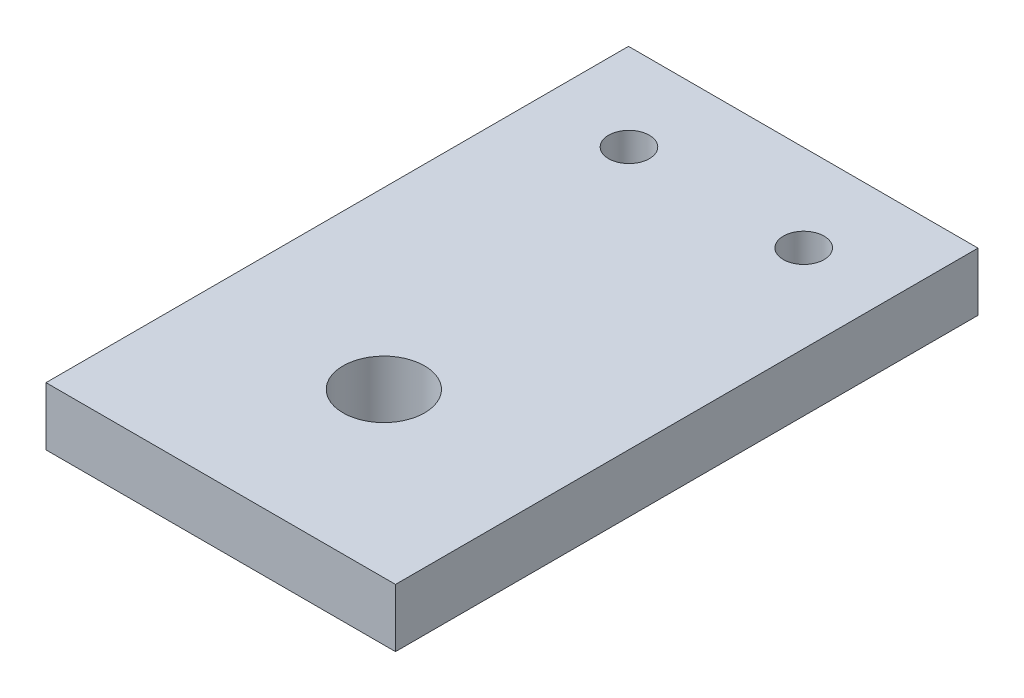
ISO-10303-21;
HEADER;
FILE_DESCRIPTION(('STEP AP214'),'2;1');
FILE_NAME('part.step','',(''),(''),'','','');
FILE_SCHEMA(('AUTOMOTIVE_DESIGN { 1 0 10303 214 1 1 1 1 }'));
ENDSEC;
DATA;
#1=APPLICATION_CONTEXT('core data for automotive mechanical design processes');
#2=APPLICATION_PROTOCOL_DEFINITION('international standard','automotive_design',2000,#1);
#3=PRODUCT_CONTEXT('',#1,'mechanical');
#4=PRODUCT('Part','Part','',(#3));
#5=PRODUCT_RELATED_PRODUCT_CATEGORY('part','',(#4));
#6=PRODUCT_DEFINITION_FORMATION('','',#4);
#7=PRODUCT_DEFINITION_CONTEXT('part definition',#1,'design');
#8=PRODUCT_DEFINITION('design','',#6,#7);
#9=PRODUCT_DEFINITION_SHAPE('','',#8);
#10=(LENGTH_UNIT() NAMED_UNIT(*) SI_UNIT(.MILLI.,.METRE.));
#11=(NAMED_UNIT(*) PLANE_ANGLE_UNIT() SI_UNIT($,.RADIAN.));
#12=(NAMED_UNIT(*) SI_UNIT($,.STERADIAN.) SOLID_ANGLE_UNIT());
#13=UNCERTAINTY_MEASURE_WITH_UNIT(LENGTH_MEASURE(1.E-05),#10,'distance_accuracy_value','');
#14=(GEOMETRIC_REPRESENTATION_CONTEXT(3) GLOBAL_UNCERTAINTY_ASSIGNED_CONTEXT((#13)) GLOBAL_UNIT_ASSIGNED_CONTEXT((#10,
#11,#12)) REPRESENTATION_CONTEXT('',''));
#15=CARTESIAN_POINT('',(0.,0.,0.));
#16=DIRECTION('',(0.,0.,1.));
#17=DIRECTION('',(1.,0.,0.));
#18=AXIS2_PLACEMENT_3D('',#15,#16,#17);
#19=CARTESIAN_POINT('',(0.,5.,0.));
#20=DIRECTION('',(0.,-1.,0.));
#21=DIRECTION('',(0.,0.,-1.));
#22=AXIS2_PLACEMENT_3D('',#19,#20,#21);
#23=PLANE('',#22);
#24=CARTESIAN_POINT('',(-7.50000000000001,5.,-28.5391035930864));
#25=DIRECTION('',(0.,-1.,0.));
#26=DIRECTION('',(0.,0.,-1.));
#27=AXIS2_PLACEMENT_3D('',#24,#25,#26);
#28=CIRCLE('',#27,1.75);
#29=CARTESIAN_POINT('',(-7.50000000000001,5.,-30.2891035930864));
#30=VERTEX_POINT('',#29);
#31=EDGE_CURVE('E126',#30,#30,#28,.T.);
#32=ORIENTED_EDGE('',*,*,#31,.T.);
#33=EDGE_LOOP('',(#32));
#34=FACE_BOUND('',#33,.T.);
#35=CARTESIAN_POINT('',(7.49999999999999,5.,-28.5391035930864));
#36=DIRECTION('',(0.,-1.,0.));
#37=DIRECTION('',(0.,0.,-1.));
#38=AXIS2_PLACEMENT_3D('',#35,#36,#37);
#39=CIRCLE('',#38,1.75);
#40=CARTESIAN_POINT('',(7.49999999999999,5.,-30.2891035930864));
#41=VERTEX_POINT('',#40);
#42=EDGE_CURVE('E118',#41,#41,#39,.T.);
#43=ORIENTED_EDGE('',*,*,#42,.T.);
#44=EDGE_LOOP('',(#43));
#45=FACE_BOUND('',#44,.T.);
#46=DIRECTION('',(0.,0.,-1.));
#47=VECTOR('',#46,1.);
#48=CARTESIAN_POINT('',(15.,5.,-36.));
#49=LINE('',#48,#47);
#50=CARTESIAN_POINT('',(15.,5.,14.));
#51=VERTEX_POINT('',#50);
#52=CARTESIAN_POINT('',(15.,5.,-36.));
#53=VERTEX_POINT('',#52);
#54=EDGE_CURVE('E88',#51,#53,#49,.T.);
#55=ORIENTED_EDGE('',*,*,#54,.T.);
#56=DIRECTION('',(-1.,0.,0.));
#57=VECTOR('',#56,1.);
#58=CARTESIAN_POINT('',(15.,5.,-36.));
#59=LINE('',#58,#57);
#60=CARTESIAN_POINT('',(-15.,5.,-36.));
#61=VERTEX_POINT('',#60);
#62=EDGE_CURVE('E83',#53,#61,#59,.T.);
#63=ORIENTED_EDGE('',*,*,#62,.T.);
#64=DIRECTION('',(0.,0.,1.));
#65=VECTOR('',#64,1.);
#66=CARTESIAN_POINT('',(-15.,5.,-36.));
#67=LINE('',#66,#65);
#68=CARTESIAN_POINT('',(-15.,5.,14.));
#69=VERTEX_POINT('',#68);
#70=EDGE_CURVE('E86',#61,#69,#67,.T.);
#71=ORIENTED_EDGE('',*,*,#70,.T.);
#72=DIRECTION('',(1.,0.,0.));
#73=VECTOR('',#72,1.);
#74=CARTESIAN_POINT('',(15.,5.,14.));
#75=LINE('',#74,#73);
#76=EDGE_CURVE('E53',#69,#51,#75,.T.);
#77=ORIENTED_EDGE('',*,*,#76,.T.);
#78=EDGE_LOOP('',(#55,#63,#71,#77));
#79=FACE_BOUND('',#78,.T.);
#80=CARTESIAN_POINT('',(0.,5.,0.));
#81=DIRECTION('',(0.,1.,0.));
#82=DIRECTION('',(0.,0.,1.));
#83=AXIS2_PLACEMENT_3D('',#80,#81,#82);
#84=CIRCLE('',#83,3.5);
#85=CARTESIAN_POINT('',(0.,5.,3.5));
#86=VERTEX_POINT('',#85);
#87=EDGE_CURVE('E103',#86,#86,#84,.T.);
#88=ORIENTED_EDGE('',*,*,#87,.F.);
#89=EDGE_LOOP('',(#88));
#90=FACE_BOUND('',#89,.T.);
#91=ADVANCED_FACE('F36',(#34,#45,#79,#90),#23,.F.);
#92=CARTESIAN_POINT('',(0.,0.,0.));
#93=DIRECTION('',(0.,-1.,0.));
#94=DIRECTION('',(0.,0.,-1.));
#95=AXIS2_PLACEMENT_3D('',#92,#93,#94);
#96=PLANE('',#95);
#97=CARTESIAN_POINT('',(-7.50000000000001,0.,-28.5391035930864));
#98=DIRECTION('',(0.,-1.,0.));
#99=DIRECTION('',(0.,0.,-1.));
#100=AXIS2_PLACEMENT_3D('',#97,#98,#99);
#101=CIRCLE('',#100,1.75);
#102=CARTESIAN_POINT('',(-7.50000000000001,0.,-30.2891035930864));
#103=VERTEX_POINT('',#102);
#104=EDGE_CURVE('E129',#103,#103,#101,.T.);
#105=ORIENTED_EDGE('',*,*,#104,.F.);
#106=EDGE_LOOP('',(#105));
#107=FACE_BOUND('',#106,.T.);
#108=CARTESIAN_POINT('',(7.49999999999999,0.,-28.5391035930864));
#109=DIRECTION('',(0.,-1.,0.));
#110=DIRECTION('',(0.,0.,-1.));
#111=AXIS2_PLACEMENT_3D('',#108,#109,#110);
#112=CIRCLE('',#111,1.75);
#113=CARTESIAN_POINT('',(7.49999999999999,0.,-30.2891035930864));
#114=VERTEX_POINT('',#113);
#115=EDGE_CURVE('E123',#114,#114,#112,.T.);
#116=ORIENTED_EDGE('',*,*,#115,.F.);
#117=EDGE_LOOP('',(#116));
#118=FACE_BOUND('',#117,.T.);
#119=DIRECTION('',(0.,0.,-1.));
#120=VECTOR('',#119,1.);
#121=CARTESIAN_POINT('',(15.,0.,-36.));
#122=LINE('',#121,#120);
#123=CARTESIAN_POINT('',(15.,0.,14.));
#124=VERTEX_POINT('',#123);
#125=CARTESIAN_POINT('',(15.,0.,-36.));
#126=VERTEX_POINT('',#125);
#127=EDGE_CURVE('E100',#124,#126,#122,.T.);
#128=ORIENTED_EDGE('',*,*,#127,.F.);
#129=DIRECTION('',(1.,0.,0.));
#130=VECTOR('',#129,1.);
#131=CARTESIAN_POINT('',(15.,0.,14.));
#132=LINE('',#131,#130);
#133=CARTESIAN_POINT('',(-15.,0.,14.));
#134=VERTEX_POINT('',#133);
#135=EDGE_CURVE('E76',#134,#124,#132,.T.);
#136=ORIENTED_EDGE('',*,*,#135,.F.);
#137=DIRECTION('',(0.,0.,1.));
#138=VECTOR('',#137,1.);
#139=CARTESIAN_POINT('',(-15.,0.,-36.));
#140=LINE('',#139,#138);
#141=CARTESIAN_POINT('',(-15.,0.,-36.));
#142=VERTEX_POINT('',#141);
#143=EDGE_CURVE('E70',#142,#134,#140,.T.);
#144=ORIENTED_EDGE('',*,*,#143,.F.);
#145=DIRECTION('',(-1.,0.,0.));
#146=VECTOR('',#145,1.);
#147=CARTESIAN_POINT('',(15.,0.,-36.));
#148=LINE('',#147,#146);
#149=EDGE_CURVE('E92',#126,#142,#148,.T.);
#150=ORIENTED_EDGE('',*,*,#149,.F.);
#151=EDGE_LOOP('',(#128,#136,#144,#150));
#152=FACE_BOUND('',#151,.T.);
#153=CARTESIAN_POINT('',(0.,0.,0.));
#154=DIRECTION('',(0.,1.,0.));
#155=DIRECTION('',(0.,0.,1.));
#156=AXIS2_PLACEMENT_3D('',#153,#154,#155);
#157=CIRCLE('',#156,3.5);
#158=CARTESIAN_POINT('',(0.,0.,3.5));
#159=VERTEX_POINT('',#158);
#160=EDGE_CURVE('E115',#159,#159,#157,.T.);
#161=ORIENTED_EDGE('',*,*,#160,.T.);
#162=EDGE_LOOP('',(#161));
#163=FACE_BOUND('',#162,.T.);
#164=ADVANCED_FACE('F111',(#107,#118,#152,#163),#96,.T.);
#165=CARTESIAN_POINT('',(15.,5.,-36.));
#166=DIRECTION('',(-1.,0.,0.));
#167=DIRECTION('',(0.,0.,1.));
#168=AXIS2_PLACEMENT_3D('',#165,#166,#167);
#169=PLANE('',#168);
#170=ORIENTED_EDGE('',*,*,#127,.T.);
#171=DIRECTION('',(0.,-1.,0.));
#172=VECTOR('',#171,1.);
#173=CARTESIAN_POINT('',(15.,5.,-36.));
#174=LINE('',#173,#172);
#175=EDGE_CURVE('E11',#53,#126,#174,.T.);
#176=ORIENTED_EDGE('',*,*,#175,.F.);
#177=ORIENTED_EDGE('',*,*,#54,.F.);
#178=DIRECTION('',(0.,-1.,0.));
#179=VECTOR('',#178,1.);
#180=CARTESIAN_POINT('',(15.,5.,14.));
#181=LINE('',#180,#179);
#182=EDGE_CURVE('E96',#51,#124,#181,.T.);
#183=ORIENTED_EDGE('',*,*,#182,.T.);
#184=EDGE_LOOP('',(#170,#176,#177,#183));
#185=FACE_BOUND('',#184,.T.);
#186=ADVANCED_FACE('F38',(#185),#169,.F.);
#187=CARTESIAN_POINT('',(15.,5.,-36.));
#188=DIRECTION('',(0.,0.,1.));
#189=DIRECTION('',(1.,0.,0.));
#190=AXIS2_PLACEMENT_3D('',#187,#188,#189);
#191=PLANE('',#190);
#192=ORIENTED_EDGE('',*,*,#149,.T.);
#193=DIRECTION('',(0.,-1.,0.));
#194=VECTOR('',#193,1.);
#195=CARTESIAN_POINT('',(-15.,5.,-36.));
#196=LINE('',#195,#194);
#197=EDGE_CURVE('E45',#61,#142,#196,.T.);
#198=ORIENTED_EDGE('',*,*,#197,.F.);
#199=ORIENTED_EDGE('',*,*,#62,.F.);
#200=ORIENTED_EDGE('',*,*,#175,.T.);
#201=EDGE_LOOP('',(#192,#198,#199,#200));
#202=FACE_BOUND('',#201,.T.);
#203=ADVANCED_FACE('F91',(#202),#191,.F.);
#204=CARTESIAN_POINT('',(-15.,5.,-36.));
#205=DIRECTION('',(1.,0.,0.));
#206=DIRECTION('',(0.,0.,-1.));
#207=AXIS2_PLACEMENT_3D('',#204,#205,#206);
#208=PLANE('',#207);
#209=ORIENTED_EDGE('',*,*,#143,.T.);
#210=DIRECTION('',(0.,-1.,0.));
#211=VECTOR('',#210,1.);
#212=CARTESIAN_POINT('',(-15.,5.,14.));
#213=LINE('',#212,#211);
#214=EDGE_CURVE('E93',#69,#134,#213,.T.);
#215=ORIENTED_EDGE('',*,*,#214,.F.);
#216=ORIENTED_EDGE('',*,*,#70,.F.);
#217=ORIENTED_EDGE('',*,*,#197,.T.);
#218=EDGE_LOOP('',(#209,#215,#216,#217));
#219=FACE_BOUND('',#218,.T.);
#220=ADVANCED_FACE('F94',(#219),#208,.F.);
#221=CARTESIAN_POINT('',(15.,5.,14.));
#222=DIRECTION('',(0.,0.,-1.));
#223=DIRECTION('',(-1.,0.,0.));
#224=AXIS2_PLACEMENT_3D('',#221,#222,#223);
#225=PLANE('',#224);
#226=ORIENTED_EDGE('',*,*,#135,.T.);
#227=ORIENTED_EDGE('',*,*,#182,.F.);
#228=ORIENTED_EDGE('',*,*,#76,.F.);
#229=ORIENTED_EDGE('',*,*,#214,.T.);
#230=EDGE_LOOP('',(#226,#227,#228,#229));
#231=FACE_BOUND('',#230,.T.);
#232=ADVANCED_FACE('F108',(#231),#225,.F.);
#233=CARTESIAN_POINT('',(0.,5.,0.));
#234=DIRECTION('',(0.,-1.,0.));
#235=DIRECTION('',(0.,0.,-1.));
#236=AXIS2_PLACEMENT_3D('',#233,#234,#235);
#237=CYLINDRICAL_SURFACE('',#236,3.5);
#238=ORIENTED_EDGE('',*,*,#87,.T.);
#239=EDGE_LOOP('',(#238));
#240=FACE_BOUND('',#239,.T.);
#241=ORIENTED_EDGE('',*,*,#160,.F.);
#242=EDGE_LOOP('',(#241));
#243=FACE_BOUND('',#242,.T.);
#244=ADVANCED_FACE('F144',(#240,#243),#237,.F.);
#245=CARTESIAN_POINT('',(7.49999999999999,10.,-28.5391035930864));
#246=DIRECTION('',(0.,-1.,0.));
#247=DIRECTION('',(0.,0.,-1.));
#248=AXIS2_PLACEMENT_3D('',#245,#246,#247);
#249=CYLINDRICAL_SURFACE('',#248,1.75);
#250=ORIENTED_EDGE('',*,*,#115,.T.);
#251=EDGE_LOOP('',(#250));
#252=FACE_BOUND('',#251,.T.);
#253=ORIENTED_EDGE('',*,*,#42,.F.);
#254=EDGE_LOOP('',(#253));
#255=FACE_BOUND('',#254,.T.);
#256=ADVANCED_FACE('F141',(#252,#255),#249,.F.);
#257=CARTESIAN_POINT('',(-7.50000000000001,10.,-28.5391035930864));
#258=DIRECTION('',(0.,-1.,0.));
#259=DIRECTION('',(0.,0.,-1.));
#260=AXIS2_PLACEMENT_3D('',#257,#258,#259);
#261=CYLINDRICAL_SURFACE('',#260,1.75);
#262=ORIENTED_EDGE('',*,*,#104,.T.);
#263=EDGE_LOOP('',(#262));
#264=FACE_BOUND('',#263,.T.);
#265=ORIENTED_EDGE('',*,*,#31,.F.);
#266=EDGE_LOOP('',(#265));
#267=FACE_BOUND('',#266,.T.);
#268=ADVANCED_FACE('F133',(#264,#267),#261,.F.);
#269=CLOSED_SHELL('',(#91,#164,#186,#203,#220,#232,#244,#256,#268));
#270=MANIFOLD_SOLID_BREP('B2',#269);
#271=ADVANCED_BREP_SHAPE_REPRESENTATION('',(#18,#270),#14);
#272=SHAPE_DEFINITION_REPRESENTATION(#9,#271);
ENDSEC;
END-ISO-10303-21;
